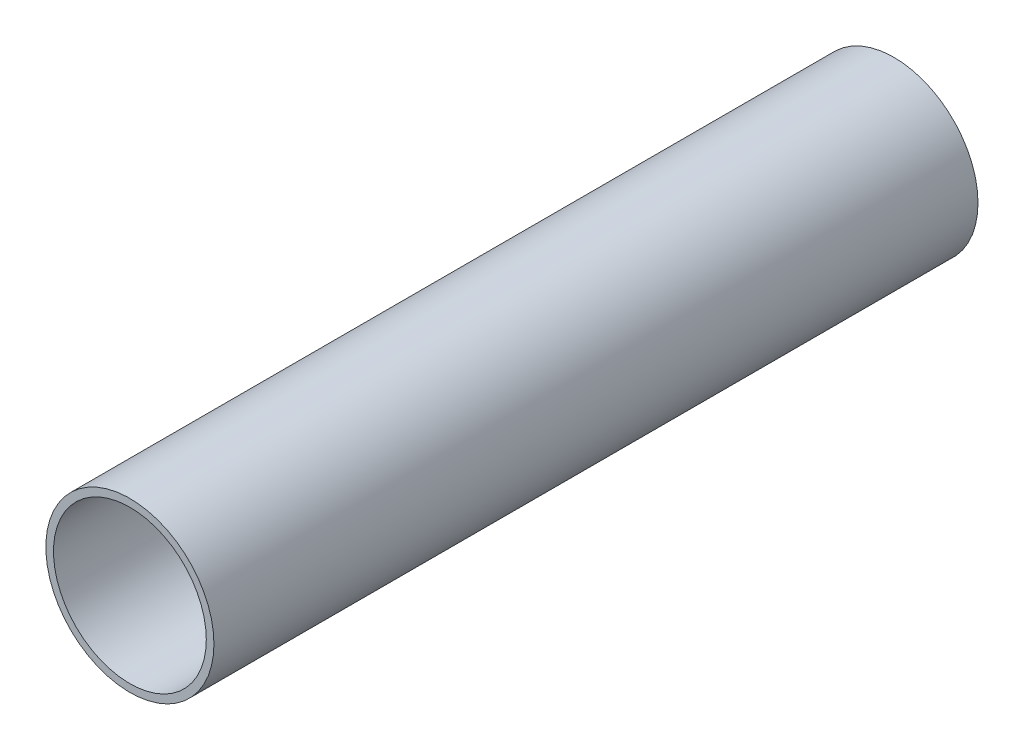
ISO-10303-21;
HEADER;
FILE_DESCRIPTION(('STEP AP214'),'2;1');
FILE_NAME('part.step','',(''),(''),'','','');
FILE_SCHEMA(('AUTOMOTIVE_DESIGN { 1 0 10303 214 1 1 1 1 }'));
ENDSEC;
DATA;
#1=APPLICATION_CONTEXT('core data for automotive mechanical design processes');
#2=APPLICATION_PROTOCOL_DEFINITION('international standard','automotive_design',2000,#1);
#3=PRODUCT_CONTEXT('',#1,'mechanical');
#4=PRODUCT('Part','Part','',(#3));
#5=PRODUCT_RELATED_PRODUCT_CATEGORY('part','',(#4));
#6=PRODUCT_DEFINITION_FORMATION('','',#4);
#7=PRODUCT_DEFINITION_CONTEXT('part definition',#1,'design');
#8=PRODUCT_DEFINITION('design','',#6,#7);
#9=PRODUCT_DEFINITION_SHAPE('','',#8);
#10=(LENGTH_UNIT() NAMED_UNIT(*) SI_UNIT(.MILLI.,.METRE.));
#11=(NAMED_UNIT(*) PLANE_ANGLE_UNIT() SI_UNIT($,.RADIAN.));
#12=(NAMED_UNIT(*) SI_UNIT($,.STERADIAN.) SOLID_ANGLE_UNIT());
#13=UNCERTAINTY_MEASURE_WITH_UNIT(LENGTH_MEASURE(1.E-05),#10,'distance_accuracy_value','');
#14=(GEOMETRIC_REPRESENTATION_CONTEXT(3) GLOBAL_UNCERTAINTY_ASSIGNED_CONTEXT((#13)) GLOBAL_UNIT_ASSIGNED_CONTEXT((#10,
#11,#12)) REPRESENTATION_CONTEXT('',''));
#15=CARTESIAN_POINT('',(0.,0.,0.));
#16=DIRECTION('',(0.,0.,1.));
#17=DIRECTION('',(1.,0.,0.));
#18=AXIS2_PLACEMENT_3D('',#15,#16,#17);
#19=CARTESIAN_POINT('',(0.,0.,100.));
#20=DIRECTION('',(0.,0.,1.));
#21=DIRECTION('',(1.,0.,0.));
#22=AXIS2_PLACEMENT_3D('',#19,#20,#21);
#23=PLANE('',#22);
#24=CARTESIAN_POINT('',(0.,0.,100.));
#25=DIRECTION('',(0.,0.,1.));
#26=DIRECTION('',(1.,0.,0.));
#27=AXIS2_PLACEMENT_3D('',#24,#25,#26);
#28=CIRCLE('',#27,11.);
#29=CARTESIAN_POINT('',(11.,0.,100.));
#30=VERTEX_POINT('',#29);
#31=EDGE_CURVE('E10',#30,#30,#28,.T.);
#32=ORIENTED_EDGE('',*,*,#31,.T.);
#33=EDGE_LOOP('',(#32));
#34=FACE_BOUND('',#33,.T.);
#35=CARTESIAN_POINT('',(0.,0.,100.));
#36=DIRECTION('',(0.,0.,1.));
#37=DIRECTION('',(1.,0.,0.));
#38=AXIS2_PLACEMENT_3D('',#35,#36,#37);
#39=CIRCLE('',#38,10.);
#40=CARTESIAN_POINT('',(10.,0.,100.));
#41=VERTEX_POINT('',#40);
#42=EDGE_CURVE('E42',#41,#41,#39,.T.);
#43=ORIENTED_EDGE('',*,*,#42,.F.);
#44=EDGE_LOOP('',(#43));
#45=FACE_BOUND('',#44,.T.);
#46=ADVANCED_FACE('F31',(#34,#45),#23,.T.);
#47=CARTESIAN_POINT('',(0.,0.,0.));
#48=DIRECTION('',(0.,0.,1.));
#49=DIRECTION('',(1.,0.,0.));
#50=AXIS2_PLACEMENT_3D('',#47,#48,#49);
#51=PLANE('',#50);
#52=CARTESIAN_POINT('',(0.,0.,0.));
#53=DIRECTION('',(0.,0.,1.));
#54=DIRECTION('',(1.,0.,0.));
#55=AXIS2_PLACEMENT_3D('',#52,#53,#54);
#56=CIRCLE('',#55,11.);
#57=CARTESIAN_POINT('',(11.,0.,0.));
#58=VERTEX_POINT('',#57);
#59=EDGE_CURVE('E35',#58,#58,#56,.T.);
#60=ORIENTED_EDGE('',*,*,#59,.F.);
#61=EDGE_LOOP('',(#60));
#62=FACE_BOUND('',#61,.T.);
#63=CARTESIAN_POINT('',(0.,0.,0.));
#64=DIRECTION('',(0.,0.,1.));
#65=DIRECTION('',(1.,0.,0.));
#66=AXIS2_PLACEMENT_3D('',#63,#64,#65);
#67=CIRCLE('',#66,10.);
#68=CARTESIAN_POINT('',(10.,0.,0.));
#69=VERTEX_POINT('',#68);
#70=EDGE_CURVE('E44',#69,#69,#67,.T.);
#71=ORIENTED_EDGE('',*,*,#70,.T.);
#72=EDGE_LOOP('',(#71));
#73=FACE_BOUND('',#72,.T.);
#74=ADVANCED_FACE('F54',(#62,#73),#51,.F.);
#75=CARTESIAN_POINT('',(0.,0.,100.));
#76=DIRECTION('',(0.,0.,-1.));
#77=DIRECTION('',(-1.,0.,0.));
#78=AXIS2_PLACEMENT_3D('',#75,#76,#77);
#79=CYLINDRICAL_SURFACE('',#78,11.);
#80=ORIENTED_EDGE('',*,*,#31,.F.);
#81=EDGE_LOOP('',(#80));
#82=FACE_BOUND('',#81,.T.);
#83=ORIENTED_EDGE('',*,*,#59,.T.);
#84=EDGE_LOOP('',(#83));
#85=FACE_BOUND('',#84,.T.);
#86=ADVANCED_FACE('F33',(#82,#85),#79,.T.);
#87=CARTESIAN_POINT('',(0.,0.,100.));
#88=DIRECTION('',(0.,0.,-1.));
#89=DIRECTION('',(-1.,0.,0.));
#90=AXIS2_PLACEMENT_3D('',#87,#88,#89);
#91=CYLINDRICAL_SURFACE('',#90,10.);
#92=ORIENTED_EDGE('',*,*,#42,.T.);
#93=EDGE_LOOP('',(#92));
#94=FACE_BOUND('',#93,.T.);
#95=ORIENTED_EDGE('',*,*,#70,.F.);
#96=EDGE_LOOP('',(#95));
#97=FACE_BOUND('',#96,.T.);
#98=ADVANCED_FACE('F50',(#94,#97),#91,.F.);
#99=CLOSED_SHELL('',(#46,#74,#86,#98));
#100=MANIFOLD_SOLID_BREP('B2',#99);
#101=ADVANCED_BREP_SHAPE_REPRESENTATION('',(#18,#100),#14);
#102=SHAPE_DEFINITION_REPRESENTATION(#9,#101);
ENDSEC;
END-ISO-10303-21;
